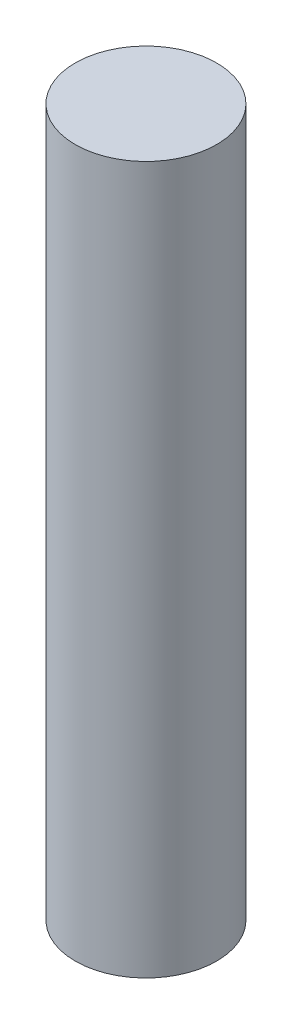
ISO-10303-21;
HEADER;
FILE_DESCRIPTION(('STEP AP214'),'2;1');
FILE_NAME('part.step','',(''),(''),'','','');
FILE_SCHEMA(('AUTOMOTIVE_DESIGN { 1 0 10303 214 1 1 1 1 }'));
ENDSEC;
DATA;
#1=APPLICATION_CONTEXT('core data for automotive mechanical design processes');
#2=APPLICATION_PROTOCOL_DEFINITION('international standard','automotive_design',2000,#1);
#3=PRODUCT_CONTEXT('',#1,'mechanical');
#4=PRODUCT('Part','Part','',(#3));
#5=PRODUCT_RELATED_PRODUCT_CATEGORY('part','',(#4));
#6=PRODUCT_DEFINITION_FORMATION('','',#4);
#7=PRODUCT_DEFINITION_CONTEXT('part definition',#1,'design');
#8=PRODUCT_DEFINITION('design','',#6,#7);
#9=PRODUCT_DEFINITION_SHAPE('','',#8);
#10=(LENGTH_UNIT() NAMED_UNIT(*) SI_UNIT(.MILLI.,.METRE.));
#11=(NAMED_UNIT(*) PLANE_ANGLE_UNIT() SI_UNIT($,.RADIAN.));
#12=(NAMED_UNIT(*) SI_UNIT($,.STERADIAN.) SOLID_ANGLE_UNIT());
#13=UNCERTAINTY_MEASURE_WITH_UNIT(LENGTH_MEASURE(1.E-05),#10,'distance_accuracy_value','');
#14=(GEOMETRIC_REPRESENTATION_CONTEXT(3) GLOBAL_UNCERTAINTY_ASSIGNED_CONTEXT((#13)) GLOBAL_UNIT_ASSIGNED_CONTEXT((#10,
#11,#12)) REPRESENTATION_CONTEXT('',''));
#15=CARTESIAN_POINT('',(0.,0.,0.));
#16=DIRECTION('',(0.,0.,1.));
#17=DIRECTION('',(1.,0.,0.));
#18=AXIS2_PLACEMENT_3D('',#15,#16,#17);
#19=CARTESIAN_POINT('',(0.,1.,0.));
#20=DIRECTION('',(0.,-1.,0.));
#21=DIRECTION('',(0.,0.,-1.));
#22=AXIS2_PLACEMENT_3D('',#19,#20,#21);
#23=CYLINDRICAL_SURFACE('',#22,0.1);
#24=CARTESIAN_POINT('',(0.,1.,0.));
#25=DIRECTION('',(0.,1.,0.));
#26=DIRECTION('',(0.,0.,1.));
#27=AXIS2_PLACEMENT_3D('',#24,#25,#26);
#28=CIRCLE('',#27,0.1);
#29=CARTESIAN_POINT('',(0.,1.,0.1));
#30=VERTEX_POINT('',#29);
#31=EDGE_CURVE('E10',#30,#30,#28,.T.);
#32=ORIENTED_EDGE('',*,*,#31,.F.);
#33=EDGE_LOOP('',(#32));
#34=FACE_BOUND('',#33,.T.);
#35=CARTESIAN_POINT('',(0.,0.,0.));
#36=DIRECTION('',(0.,1.,0.));
#37=DIRECTION('',(0.,0.,1.));
#38=AXIS2_PLACEMENT_3D('',#35,#36,#37);
#39=CIRCLE('',#38,0.1);
#40=CARTESIAN_POINT('',(0.,0.,0.1));
#41=VERTEX_POINT('',#40);
#42=EDGE_CURVE('E34',#41,#41,#39,.T.);
#43=ORIENTED_EDGE('',*,*,#42,.T.);
#44=EDGE_LOOP('',(#43));
#45=FACE_BOUND('',#44,.T.);
#46=ADVANCED_FACE('F31',(#34,#45),#23,.T.);
#47=CARTESIAN_POINT('',(0.,1.,0.));
#48=DIRECTION('',(0.,1.,0.));
#49=DIRECTION('',(0.,0.,1.));
#50=AXIS2_PLACEMENT_3D('',#47,#48,#49);
#51=PLANE('',#50);
#52=ORIENTED_EDGE('',*,*,#31,.T.);
#53=EDGE_LOOP('',(#52));
#54=FACE_BOUND('',#53,.T.);
#55=ADVANCED_FACE('F46',(#54),#51,.T.);
#56=CARTESIAN_POINT('',(0.,0.,0.));
#57=DIRECTION('',(0.,1.,0.));
#58=DIRECTION('',(0.,0.,1.));
#59=AXIS2_PLACEMENT_3D('',#56,#57,#58);
#60=PLANE('',#59);
#61=ORIENTED_EDGE('',*,*,#42,.F.);
#62=EDGE_LOOP('',(#61));
#63=FACE_BOUND('',#62,.T.);
#64=ADVANCED_FACE('F44',(#63),#60,.F.);
#65=CLOSED_SHELL('',(#46,#55,#64));
#66=MANIFOLD_SOLID_BREP('B2',#65);
#67=ADVANCED_BREP_SHAPE_REPRESENTATION('',(#18,#66),#14);
#68=SHAPE_DEFINITION_REPRESENTATION(#9,#67);
ENDSEC;
END-ISO-10303-21;
